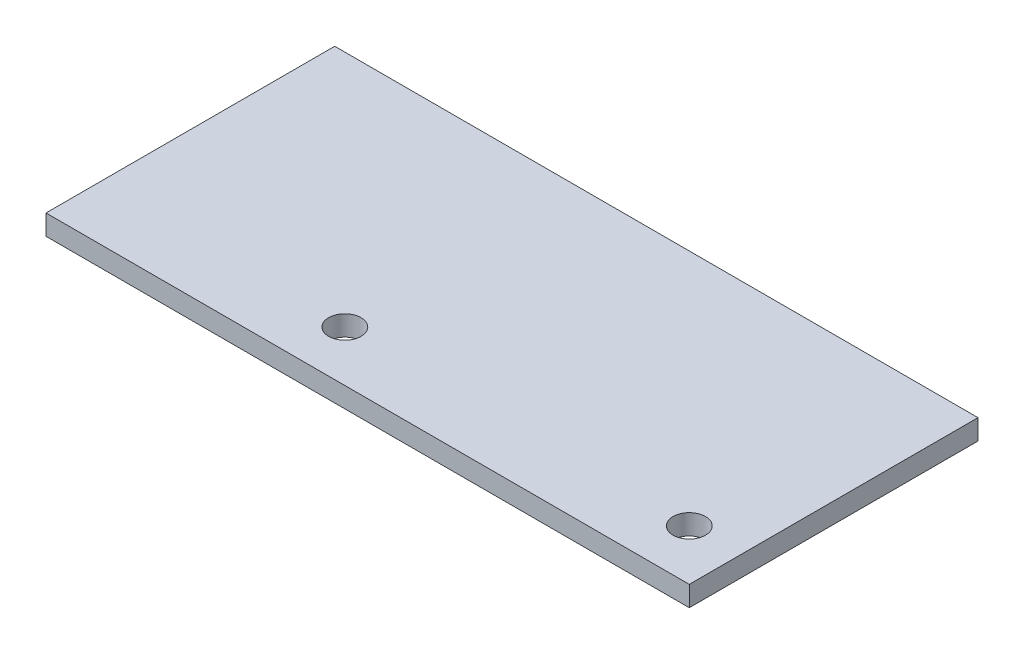
ISO-10303-21;
HEADER;
FILE_DESCRIPTION(('STEP AP214'),'2;1');
FILE_NAME('part.step','',(''),(''),'','','');
FILE_SCHEMA(('AUTOMOTIVE_DESIGN { 1 0 10303 214 1 1 1 1 }'));
ENDSEC;
DATA;
#1=APPLICATION_CONTEXT('core data for automotive mechanical design processes');
#2=APPLICATION_PROTOCOL_DEFINITION('international standard','automotive_design',2000,#1);
#3=PRODUCT_CONTEXT('',#1,'mechanical');
#4=PRODUCT('Part','Part','',(#3));
#5=PRODUCT_RELATED_PRODUCT_CATEGORY('part','',(#4));
#6=PRODUCT_DEFINITION_FORMATION('','',#4);
#7=PRODUCT_DEFINITION_CONTEXT('part definition',#1,'design');
#8=PRODUCT_DEFINITION('design','',#6,#7);
#9=PRODUCT_DEFINITION_SHAPE('','',#8);
#10=(LENGTH_UNIT() NAMED_UNIT(*) SI_UNIT(.MILLI.,.METRE.));
#11=(NAMED_UNIT(*) PLANE_ANGLE_UNIT() SI_UNIT($,.RADIAN.));
#12=(NAMED_UNIT(*) SI_UNIT($,.STERADIAN.) SOLID_ANGLE_UNIT());
#13=UNCERTAINTY_MEASURE_WITH_UNIT(LENGTH_MEASURE(1.E-05),#10,'distance_accuracy_value','');
#14=(GEOMETRIC_REPRESENTATION_CONTEXT(3) GLOBAL_UNCERTAINTY_ASSIGNED_CONTEXT((#13)) GLOBAL_UNIT_ASSIGNED_CONTEXT((#10,
#11,#12)) REPRESENTATION_CONTEXT('',''));
#15=CARTESIAN_POINT('',(0.,0.,0.));
#16=DIRECTION('',(0.,0.,1.));
#17=DIRECTION('',(1.,0.,0.));
#18=AXIS2_PLACEMENT_3D('',#15,#16,#17);
#19=CARTESIAN_POINT('',(0.,2.,0.));
#20=DIRECTION('',(0.,-1.,0.));
#21=DIRECTION('',(0.,0.,-1.));
#22=AXIS2_PLACEMENT_3D('',#19,#20,#21);
#23=PLANE('',#22);
#24=DIRECTION('',(0.,0.,1.));
#25=VECTOR('',#24,1.);
#26=CARTESIAN_POINT('',(0.,2.,0.));
#27=LINE('',#26,#25);
#28=CARTESIAN_POINT('',(0.,2.,-28.5));
#29=VERTEX_POINT('',#28);
#30=CARTESIAN_POINT('',(0.,2.,0.));
#31=VERTEX_POINT('',#30);
#32=EDGE_CURVE('E85',#29,#31,#27,.T.);
#33=ORIENTED_EDGE('',*,*,#32,.T.);
#34=DIRECTION('',(1.,0.,0.));
#35=VECTOR('',#34,1.);
#36=CARTESIAN_POINT('',(0.,2.,0.));
#37=LINE('',#36,#35);
#38=CARTESIAN_POINT('',(63.5,2.,0.));
#39=VERTEX_POINT('',#38);
#40=EDGE_CURVE('E80',#31,#39,#37,.T.);
#41=ORIENTED_EDGE('',*,*,#40,.T.);
#42=DIRECTION('',(0.,0.,-1.));
#43=VECTOR('',#42,1.);
#44=CARTESIAN_POINT('',(63.5,2.,0.));
#45=LINE('',#44,#43);
#46=CARTESIAN_POINT('',(63.5,2.,-28.5));
#47=VERTEX_POINT('',#46);
#48=EDGE_CURVE('E83',#39,#47,#45,.T.);
#49=ORIENTED_EDGE('',*,*,#48,.T.);
#50=DIRECTION('',(-1.,0.,0.));
#51=VECTOR('',#50,1.);
#52=CARTESIAN_POINT('',(0.,2.,-28.5));
#53=LINE('',#52,#51);
#54=EDGE_CURVE('E50',#47,#29,#53,.T.);
#55=ORIENTED_EDGE('',*,*,#54,.T.);
#56=EDGE_LOOP('',(#33,#41,#49,#55));
#57=FACE_BOUND('',#56,.T.);
#58=CARTESIAN_POINT('',(58.5,2.,-5.));
#59=DIRECTION('',(0.,1.,0.));
#60=DIRECTION('',(0.,0.,1.));
#61=AXIS2_PLACEMENT_3D('',#58,#59,#60);
#62=CIRCLE('',#61,1.6);
#63=CARTESIAN_POINT('',(58.5,2.,-3.4));
#64=VERTEX_POINT('',#63);
#65=EDGE_CURVE('E100',#64,#64,#62,.T.);
#66=ORIENTED_EDGE('',*,*,#65,.F.);
#67=EDGE_LOOP('',(#66));
#68=FACE_BOUND('',#67,.T.);
#69=CARTESIAN_POINT('',(24.5,2.,-4.99999999999976));
#70=DIRECTION('',(0.,1.,0.));
#71=DIRECTION('',(0.,0.,1.));
#72=AXIS2_PLACEMENT_3D('',#69,#70,#71);
#73=CIRCLE('',#72,1.6);
#74=CARTESIAN_POINT('',(24.5,2.,-3.39999999999976));
#75=VERTEX_POINT('',#74);
#76=EDGE_CURVE('E115',#75,#75,#73,.T.);
#77=ORIENTED_EDGE('',*,*,#76,.F.);
#78=EDGE_LOOP('',(#77));
#79=FACE_BOUND('',#78,.T.);
#80=ADVANCED_FACE('F33',(#57,#68,#79),#23,.F.);
#81=CARTESIAN_POINT('',(0.,0.,0.));
#82=DIRECTION('',(0.,-1.,0.));
#83=DIRECTION('',(0.,0.,-1.));
#84=AXIS2_PLACEMENT_3D('',#81,#82,#83);
#85=PLANE('',#84);
#86=CARTESIAN_POINT('',(58.5,0.,-5.));
#87=DIRECTION('',(0.,1.,0.));
#88=DIRECTION('',(0.,0.,1.));
#89=AXIS2_PLACEMENT_3D('',#86,#87,#88);
#90=CIRCLE('',#89,1.6);
#91=CARTESIAN_POINT('',(58.5,0.,-3.4));
#92=VERTEX_POINT('',#91);
#93=EDGE_CURVE('E112',#92,#92,#90,.T.);
#94=ORIENTED_EDGE('',*,*,#93,.T.);
#95=EDGE_LOOP('',(#94));
#96=FACE_BOUND('',#95,.T.);
#97=DIRECTION('',(0.,0.,1.));
#98=VECTOR('',#97,1.);
#99=CARTESIAN_POINT('',(0.,0.,0.));
#100=LINE('',#99,#98);
#101=CARTESIAN_POINT('',(0.,0.,-28.5));
#102=VERTEX_POINT('',#101);
#103=CARTESIAN_POINT('',(0.,0.,0.));
#104=VERTEX_POINT('',#103);
#105=EDGE_CURVE('E97',#102,#104,#100,.T.);
#106=ORIENTED_EDGE('',*,*,#105,.F.);
#107=DIRECTION('',(-1.,0.,0.));
#108=VECTOR('',#107,1.);
#109=CARTESIAN_POINT('',(0.,0.,-28.5));
#110=LINE('',#109,#108);
#111=CARTESIAN_POINT('',(63.5,0.,-28.5));
#112=VERTEX_POINT('',#111);
#113=EDGE_CURVE('E73',#112,#102,#110,.T.);
#114=ORIENTED_EDGE('',*,*,#113,.F.);
#115=DIRECTION('',(0.,0.,-1.));
#116=VECTOR('',#115,1.);
#117=CARTESIAN_POINT('',(63.5,0.,0.));
#118=LINE('',#117,#116);
#119=CARTESIAN_POINT('',(63.5,0.,0.));
#120=VERTEX_POINT('',#119);
#121=EDGE_CURVE('E67',#120,#112,#118,.T.);
#122=ORIENTED_EDGE('',*,*,#121,.F.);
#123=DIRECTION('',(1.,0.,0.));
#124=VECTOR('',#123,1.);
#125=CARTESIAN_POINT('',(0.,0.,0.));
#126=LINE('',#125,#124);
#127=EDGE_CURVE('E89',#104,#120,#126,.T.);
#128=ORIENTED_EDGE('',*,*,#127,.F.);
#129=EDGE_LOOP('',(#106,#114,#122,#128));
#130=FACE_BOUND('',#129,.T.);
#131=CARTESIAN_POINT('',(24.5,0.,-4.99999999999976));
#132=DIRECTION('',(0.,1.,0.));
#133=DIRECTION('',(0.,0.,1.));
#134=AXIS2_PLACEMENT_3D('',#131,#132,#133);
#135=CIRCLE('',#134,1.6);
#136=CARTESIAN_POINT('',(24.5,0.,-3.39999999999976));
#137=VERTEX_POINT('',#136);
#138=EDGE_CURVE('E118',#137,#137,#135,.T.);
#139=ORIENTED_EDGE('',*,*,#138,.T.);
#140=EDGE_LOOP('',(#139));
#141=FACE_BOUND('',#140,.T.);
#142=ADVANCED_FACE('F108',(#96,#130,#141),#85,.T.);
#143=CARTESIAN_POINT('',(0.,2.,0.));
#144=DIRECTION('',(1.,0.,0.));
#145=DIRECTION('',(0.,0.,-1.));
#146=AXIS2_PLACEMENT_3D('',#143,#144,#145);
#147=PLANE('',#146);
#148=ORIENTED_EDGE('',*,*,#105,.T.);
#149=DIRECTION('',(0.,-1.,0.));
#150=VECTOR('',#149,1.);
#151=CARTESIAN_POINT('',(0.,2.,0.));
#152=LINE('',#151,#150);
#153=EDGE_CURVE('E11',#31,#104,#152,.T.);
#154=ORIENTED_EDGE('',*,*,#153,.F.);
#155=ORIENTED_EDGE('',*,*,#32,.F.);
#156=DIRECTION('',(0.,-1.,0.));
#157=VECTOR('',#156,1.);
#158=CARTESIAN_POINT('',(0.,2.,-28.5));
#159=LINE('',#158,#157);
#160=EDGE_CURVE('E93',#29,#102,#159,.T.);
#161=ORIENTED_EDGE('',*,*,#160,.T.);
#162=EDGE_LOOP('',(#148,#154,#155,#161));
#163=FACE_BOUND('',#162,.T.);
#164=ADVANCED_FACE('F35',(#163),#147,.F.);
#165=CARTESIAN_POINT('',(0.,2.,0.));
#166=DIRECTION('',(0.,0.,-1.));
#167=DIRECTION('',(-1.,0.,0.));
#168=AXIS2_PLACEMENT_3D('',#165,#166,#167);
#169=PLANE('',#168);
#170=ORIENTED_EDGE('',*,*,#127,.T.);
#171=DIRECTION('',(0.,-1.,0.));
#172=VECTOR('',#171,1.);
#173=CARTESIAN_POINT('',(63.5,2.,0.));
#174=LINE('',#173,#172);
#175=EDGE_CURVE('E42',#39,#120,#174,.T.);
#176=ORIENTED_EDGE('',*,*,#175,.F.);
#177=ORIENTED_EDGE('',*,*,#40,.F.);
#178=ORIENTED_EDGE('',*,*,#153,.T.);
#179=EDGE_LOOP('',(#170,#176,#177,#178));
#180=FACE_BOUND('',#179,.T.);
#181=ADVANCED_FACE('F88',(#180),#169,.F.);
#182=CARTESIAN_POINT('',(63.5,2.,0.));
#183=DIRECTION('',(-1.,0.,0.));
#184=DIRECTION('',(0.,0.,1.));
#185=AXIS2_PLACEMENT_3D('',#182,#183,#184);
#186=PLANE('',#185);
#187=ORIENTED_EDGE('',*,*,#121,.T.);
#188=DIRECTION('',(0.,-1.,0.));
#189=VECTOR('',#188,1.);
#190=CARTESIAN_POINT('',(63.5,2.,-28.5));
#191=LINE('',#190,#189);
#192=EDGE_CURVE('E90',#47,#112,#191,.T.);
#193=ORIENTED_EDGE('',*,*,#192,.F.);
#194=ORIENTED_EDGE('',*,*,#48,.F.);
#195=ORIENTED_EDGE('',*,*,#175,.T.);
#196=EDGE_LOOP('',(#187,#193,#194,#195));
#197=FACE_BOUND('',#196,.T.);
#198=ADVANCED_FACE('F91',(#197),#186,.F.);
#199=CARTESIAN_POINT('',(0.,2.,-28.5));
#200=DIRECTION('',(0.,0.,1.));
#201=DIRECTION('',(1.,0.,0.));
#202=AXIS2_PLACEMENT_3D('',#199,#200,#201);
#203=PLANE('',#202);
#204=ORIENTED_EDGE('',*,*,#113,.T.);
#205=ORIENTED_EDGE('',*,*,#160,.F.);
#206=ORIENTED_EDGE('',*,*,#54,.F.);
#207=ORIENTED_EDGE('',*,*,#192,.T.);
#208=EDGE_LOOP('',(#204,#205,#206,#207));
#209=FACE_BOUND('',#208,.T.);
#210=ADVANCED_FACE('F105',(#209),#203,.F.);
#211=CARTESIAN_POINT('',(58.5,2.,-5.));
#212=DIRECTION('',(0.,-1.,0.));
#213=DIRECTION('',(0.,0.,-1.));
#214=AXIS2_PLACEMENT_3D('',#211,#212,#213);
#215=CYLINDRICAL_SURFACE('',#214,1.6);
#216=ORIENTED_EDGE('',*,*,#65,.T.);
#217=EDGE_LOOP('',(#216));
#218=FACE_BOUND('',#217,.T.);
#219=ORIENTED_EDGE('',*,*,#93,.F.);
#220=EDGE_LOOP('',(#219));
#221=FACE_BOUND('',#220,.T.);
#222=ADVANCED_FACE('F135',(#218,#221),#215,.F.);
#223=CARTESIAN_POINT('',(24.5,2.,-4.99999999999976));
#224=DIRECTION('',(0.,-1.,0.));
#225=DIRECTION('',(0.,0.,-1.));
#226=AXIS2_PLACEMENT_3D('',#223,#224,#225);
#227=CYLINDRICAL_SURFACE('',#226,1.6);
#228=ORIENTED_EDGE('',*,*,#76,.T.);
#229=EDGE_LOOP('',(#228));
#230=FACE_BOUND('',#229,.T.);
#231=ORIENTED_EDGE('',*,*,#138,.F.);
#232=EDGE_LOOP('',(#231));
#233=FACE_BOUND('',#232,.T.);
#234=ADVANCED_FACE('F124',(#230,#233),#227,.F.);
#235=CLOSED_SHELL('',(#80,#142,#164,#181,#198,#210,#222,#234));
#236=MANIFOLD_SOLID_BREP('B2',#235);
#237=ADVANCED_BREP_SHAPE_REPRESENTATION('',(#18,#236),#14);
#238=SHAPE_DEFINITION_REPRESENTATION(#9,#237);
ENDSEC;
END-ISO-10303-21;
